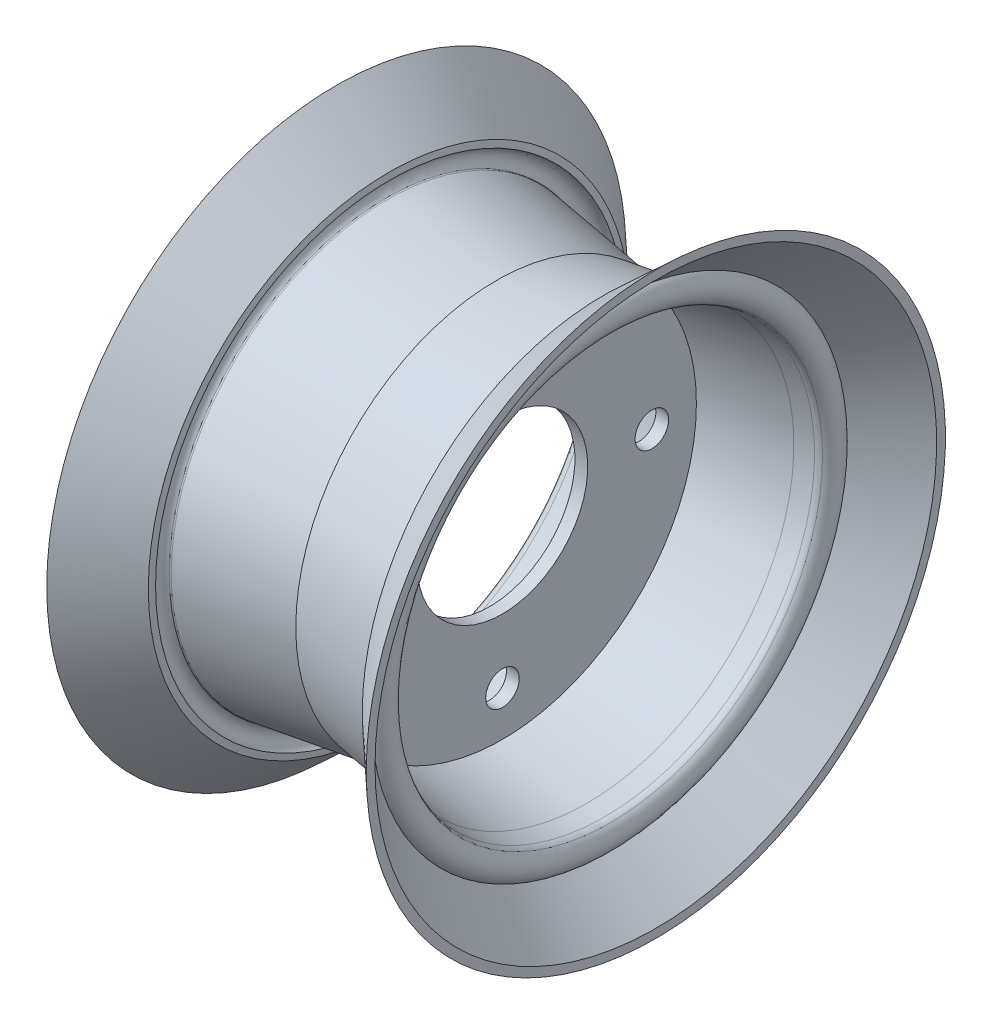
ISO-10303-21;
HEADER;
FILE_DESCRIPTION(('STEP AP214'),'2;1');
FILE_NAME('part.step','',(''),(''),'','','');
FILE_SCHEMA(('AUTOMOTIVE_DESIGN { 1 0 10303 214 1 1 1 1 }'));
ENDSEC;
DATA;
#1=APPLICATION_CONTEXT('core data for automotive mechanical design processes');
#2=APPLICATION_PROTOCOL_DEFINITION('international standard','automotive_design',2000,#1);
#3=PRODUCT_CONTEXT('',#1,'mechanical');
#4=PRODUCT('Part','Part','',(#3));
#5=PRODUCT_RELATED_PRODUCT_CATEGORY('part','',(#4));
#6=PRODUCT_DEFINITION_FORMATION('','',#4);
#7=PRODUCT_DEFINITION_CONTEXT('part definition',#1,'design');
#8=PRODUCT_DEFINITION('design','',#6,#7);
#9=PRODUCT_DEFINITION_SHAPE('','',#8);
#10=(LENGTH_UNIT() NAMED_UNIT(*) SI_UNIT(.MILLI.,.METRE.));
#11=(NAMED_UNIT(*) PLANE_ANGLE_UNIT() SI_UNIT($,.RADIAN.));
#12=(NAMED_UNIT(*) SI_UNIT($,.STERADIAN.) SOLID_ANGLE_UNIT());
#13=UNCERTAINTY_MEASURE_WITH_UNIT(LENGTH_MEASURE(1.E-05),#10,'distance_accuracy_value','');
#14=(GEOMETRIC_REPRESENTATION_CONTEXT(3) GLOBAL_UNCERTAINTY_ASSIGNED_CONTEXT((#13)) GLOBAL_UNIT_ASSIGNED_CONTEXT((#10,
#11,#12)) REPRESENTATION_CONTEXT('',''));
#15=CARTESIAN_POINT('',(0.,0.,0.));
#16=DIRECTION('',(0.,0.,1.));
#17=DIRECTION('',(1.,0.,0.));
#18=AXIS2_PLACEMENT_3D('',#15,#16,#17);
#19=CARTESIAN_POINT('',(1.50000000000001,45.4999999999999,0.));
#20=DIRECTION('',(-1.,0.,0.));
#21=DIRECTION('',(0.,0.,1.));
#22=AXIS2_PLACEMENT_3D('',#19,#20,#21);
#23=PLANE('',#22);
#24=CARTESIAN_POINT('',(1.50000000000001,-35.052,-1.9838902539883E-12));
#25=DIRECTION('',(-1.,0.,0.));
#26=DIRECTION('',(0.,0.,1.));
#27=AXIS2_PLACEMENT_3D('',#24,#25,#26);
#28=CIRCLE('',#27,3.93700000000213);
#29=CARTESIAN_POINT('',(1.50000000000001,-35.052,3.93700000000015));
#30=VERTEX_POINT('',#29);
#31=EDGE_CURVE('E84',#30,#30,#28,.T.);
#32=ORIENTED_EDGE('',*,*,#31,.T.);
#33=EDGE_LOOP('',(#32));
#34=FACE_BOUND('',#33,.T.);
#35=CARTESIAN_POINT('',(1.50000000000001,35.052,0.));
#36=DIRECTION('',(-1.,0.,0.));
#37=DIRECTION('',(0.,0.,1.));
#38=AXIS2_PLACEMENT_3D('',#35,#36,#37);
#39=CIRCLE('',#38,3.937);
#40=CARTESIAN_POINT('',(1.50000000000001,35.052,3.937));
#41=VERTEX_POINT('',#40);
#42=EDGE_CURVE('E78',#41,#41,#39,.T.);
#43=ORIENTED_EDGE('',*,*,#42,.T.);
#44=EDGE_LOOP('',(#43));
#45=FACE_BOUND('',#44,.T.);
#46=CARTESIAN_POINT('',(1.5,0.,0.));
#47=DIRECTION('',(-1.,0.,0.));
#48=DIRECTION('',(0.,0.,1.));
#49=AXIS2_PLACEMENT_3D('',#46,#47,#48);
#50=CIRCLE('',#49,45.4999999999999);
#51=CARTESIAN_POINT('',(1.5,0.,45.4999999999999));
#52=VERTEX_POINT('',#51);
#53=EDGE_CURVE('E75',#52,#52,#50,.T.);
#54=ORIENTED_EDGE('',*,*,#53,.F.);
#55=EDGE_LOOP('',(#54));
#56=FACE_BOUND('',#55,.T.);
#57=CARTESIAN_POINT('',(1.5,0.,0.));
#58=DIRECTION('',(-1.,0.,0.));
#59=DIRECTION('',(0.,0.,1.));
#60=AXIS2_PLACEMENT_3D('',#57,#58,#59);
#61=CIRCLE('',#60,20.000000000002);
#62=CARTESIAN_POINT('',(1.5,0.,20.000000000002));
#63=VERTEX_POINT('',#62);
#64=EDGE_CURVE('E10',#63,#63,#61,.T.);
#65=ORIENTED_EDGE('',*,*,#64,.T.);
#66=EDGE_LOOP('',(#65));
#67=FACE_BOUND('',#66,.T.);
#68=CARTESIAN_POINT('',(1.50000000000001,9.9194512699415E-13,-35.052000000001));
#69=DIRECTION('',(-1.,0.,0.));
#70=DIRECTION('',(0.,0.,1.));
#71=AXIS2_PLACEMENT_3D('',#68,#69,#70);
#72=CIRCLE('',#71,3.93700000000077);
#73=CARTESIAN_POINT('',(1.50000000000001,9.9194512699415E-13,-31.1150000000002));
#74=VERTEX_POINT('',#73);
#75=EDGE_CURVE('E81',#74,#74,#72,.T.);
#76=ORIENTED_EDGE('',*,*,#75,.T.);
#77=EDGE_LOOP('',(#76));
#78=FACE_BOUND('',#77,.T.);
#79=CARTESIAN_POINT('',(1.50000000000001,-9.96237758954521E-13,35.051999999999));
#80=DIRECTION('',(-1.,0.,0.));
#81=DIRECTION('',(0.,0.,1.));
#82=AXIS2_PLACEMENT_3D('',#79,#80,#81);
#83=CIRCLE('',#82,3.93700000000159);
#84=CARTESIAN_POINT('',(1.50000000000001,-9.96237758954521E-13,38.9890000000006));
#85=VERTEX_POINT('',#84);
#86=EDGE_CURVE('E87',#85,#85,#83,.T.);
#87=ORIENTED_EDGE('',*,*,#86,.T.);
#88=EDGE_LOOP('',(#87));
#89=FACE_BOUND('',#88,.T.);
#90=ADVANCED_FACE('F32',(#34,#45,#56,#67,#78,#89),#23,.F.);
#91=CARTESIAN_POINT('',(-124.142501928388,0.,0.));
#92=DIRECTION('',(-1.,0.,0.));
#93=DIRECTION('',(0.,0.,1.));
#94=AXIS2_PLACEMENT_3D('',#91,#92,#93);
#95=CYLINDRICAL_SURFACE('',#94,20.000000000002);
#96=ORIENTED_EDGE('',*,*,#64,.F.);
#97=EDGE_LOOP('',(#96));
#98=FACE_BOUND('',#97,.T.);
#99=CARTESIAN_POINT('',(-1.5,0.,0.));
#100=DIRECTION('',(-1.,0.,0.));
#101=DIRECTION('',(0.,0.,1.));
#102=AXIS2_PLACEMENT_3D('',#99,#100,#101);
#103=CIRCLE('',#102,20.000000000002);
#104=CARTESIAN_POINT('',(-1.5,0.,20.000000000002));
#105=VERTEX_POINT('',#104);
#106=EDGE_CURVE('E90',#105,#105,#103,.T.);
#107=ORIENTED_EDGE('',*,*,#106,.T.);
#108=EDGE_LOOP('',(#107));
#109=FACE_BOUND('',#108,.T.);
#110=ADVANCED_FACE('F156',(#98,#109),#95,.F.);
#111=CARTESIAN_POINT('',(25.4724020470986,0.,0.));
#112=DIRECTION('',(1.,0.,0.));
#113=DIRECTION('',(0.,0.,-1.));
#114=AXIS2_PLACEMENT_3D('',#111,#112,#113);
#115=CONICAL_SURFACE('',#114,50.7500000000004,0.146168211535246);
#116=CARTESIAN_POINT('',(-2.08166817117217E-13,0.,0.));
#117=DIRECTION('',(-1.,0.,0.));
#118=DIRECTION('',(0.,0.,1.));
#119=AXIS2_PLACEMENT_3D('',#116,#117,#118);
#120=CIRCLE('',#119,47.000000000001);
#121=CARTESIAN_POINT('',(-2.08166817117217E-13,0.,47.000000000001));
#122=VERTEX_POINT('',#121);
#123=EDGE_CURVE('E38',#122,#122,#120,.T.);
#124=ORIENTED_EDGE('',*,*,#123,.F.);
#125=EDGE_LOOP('',(#124));
#126=FACE_BOUND('',#125,.T.);
#127=CARTESIAN_POINT('',(25.4724020470986,0.,0.));
#128=DIRECTION('',(-1.,0.,0.));
#129=DIRECTION('',(0.,0.,1.));
#130=AXIS2_PLACEMENT_3D('',#127,#128,#129);
#131=CIRCLE('',#130,50.7500000000004);
#132=CARTESIAN_POINT('',(25.4724020470986,0.,50.7500000000004));
#133=VERTEX_POINT('',#132);
#134=EDGE_CURVE('E42',#133,#133,#131,.T.);
#135=ORIENTED_EDGE('',*,*,#134,.T.);
#136=EDGE_LOOP('',(#135));
#137=FACE_BOUND('',#136,.T.);
#138=ADVANCED_FACE('F158',(#126,#137),#115,.T.);
#139=CARTESIAN_POINT('',(25.4724020470988,0.,0.));
#140=DIRECTION('',(-1.,0.,0.));
#141=DIRECTION('',(0.,0.,1.));
#142=AXIS2_PLACEMENT_3D('',#139,#140,#141);
#143=TOROIDAL_SURFACE('',#142,51.25,0.499999999999622);
#144=ORIENTED_EDGE('',*,*,#134,.F.);
#145=EDGE_LOOP('',(#144));
#146=FACE_BOUND('',#145,.T.);
#147=CARTESIAN_POINT('',(25.8103133663892,0.,0.));
#148=DIRECTION('',(-1.,0.,0.));
#149=DIRECTION('',(0.,0.,1.));
#150=AXIS2_PLACEMENT_3D('',#147,#148,#149);
#151=CIRCLE('',#150,50.8814678571753);
#152=CARTESIAN_POINT('',(25.8103133663892,0.,50.8814678571753));
#153=VERTEX_POINT('',#152);
#154=EDGE_CURVE('E46',#153,#153,#151,.T.);
#155=ORIENTED_EDGE('',*,*,#154,.T.);
#156=EDGE_LOOP('',(#155));
#157=FACE_BOUND('',#156,.T.);
#158=ADVANCED_FACE('F164',(#146,#157),#143,.F.);
#159=CARTESIAN_POINT('',(24.1640290544823,0.,0.));
#160=DIRECTION('',(-1.,0.,0.));
#161=DIRECTION('',(0.,0.,1.));
#162=AXIS2_PLACEMENT_3D('',#159,#160,#161);
#163=TOROIDAL_SURFACE('',#162,52.6769350419976,2.43597094551729);
#164=ORIENTED_EDGE('',*,*,#154,.F.);
#165=EDGE_LOOP('',(#164));
#166=FACE_BOUND('',#165,.T.);
#167=CARTESIAN_POINT('',(24.897052688691,0.,0.));
#168=DIRECTION('',(-1.,0.,0.));
#169=DIRECTION('',(0.,0.,1.));
#170=AXIS2_PLACEMENT_3D('',#167,#168,#169);
#171=CIRCLE('',#170,54.9999999999994);
#172=CARTESIAN_POINT('',(24.897052688691,0.,54.9999999999994));
#173=VERTEX_POINT('',#172);
#174=EDGE_CURVE('E51',#173,#173,#171,.T.);
#175=ORIENTED_EDGE('',*,*,#174,.T.);
#176=EDGE_LOOP('',(#175));
#177=FACE_BOUND('',#176,.T.);
#178=ADVANCED_FACE('F171',(#166,#177),#163,.F.);
#179=CARTESIAN_POINT('',(25.1000000000006,0.,0.));
#180=DIRECTION('',(1.,0.,0.));
#181=DIRECTION('',(0.,0.,-1.));
#182=AXIS2_PLACEMENT_3D('',#179,#180,#181);
#183=CONICAL_SURFACE('',#182,56.4999999999994,1.43631474044547);
#184=ORIENTED_EDGE('',*,*,#174,.F.);
#185=EDGE_LOOP('',(#184));
#186=FACE_BOUND('',#185,.T.);
#187=CARTESIAN_POINT('',(25.1000000000006,0.,0.));
#188=DIRECTION('',(-1.,0.,0.));
#189=DIRECTION('',(0.,0.,1.));
#190=AXIS2_PLACEMENT_3D('',#187,#188,#189);
#191=CIRCLE('',#190,56.4999999999994);
#192=CARTESIAN_POINT('',(25.1000000000006,0.,56.4999999999994));
#193=VERTEX_POINT('',#192);
#194=EDGE_CURVE('E54',#193,#193,#191,.T.);
#195=ORIENTED_EDGE('',*,*,#194,.T.);
#196=EDGE_LOOP('',(#195));
#197=FACE_BOUND('',#196,.T.);
#198=ADVANCED_FACE('F175',(#186,#197),#183,.T.);
#199=CARTESIAN_POINT('',(37.4843362016493,0.,0.));
#200=DIRECTION('',(1.,0.,0.));
#201=DIRECTION('',(0.,0.,-1.));
#202=AXIS2_PLACEMENT_3D('',#199,#200,#201);
#203=CONICAL_SURFACE('',#202,67.9497235818508,0.746204923834872);
#204=ORIENTED_EDGE('',*,*,#194,.F.);
#205=EDGE_LOOP('',(#204));
#206=FACE_BOUND('',#205,.T.);
#207=CARTESIAN_POINT('',(37.4843362016493,0.,0.));
#208=DIRECTION('',(-1.,0.,0.));
#209=DIRECTION('',(0.,0.,1.));
#210=AXIS2_PLACEMENT_3D('',#207,#208,#209);
#211=CIRCLE('',#210,67.9497235818508);
#212=CARTESIAN_POINT('',(37.4843362016493,0.,67.9497235818508));
#213=VERTEX_POINT('',#212);
#214=EDGE_CURVE('E57',#213,#213,#211,.T.);
#215=ORIENTED_EDGE('',*,*,#214,.T.);
#216=EDGE_LOOP('',(#215));
#217=FACE_BOUND('',#216,.T.);
#218=ADVANCED_FACE('F179',(#206,#217),#203,.T.);
#219=CARTESIAN_POINT('',(37.4843362016493,67.9497235818508,0.));
#220=DIRECTION('',(-1.,0.,0.));
#221=DIRECTION('',(0.,0.,1.));
#222=AXIS2_PLACEMENT_3D('',#219,#220,#221);
#223=PLANE('',#222);
#224=ORIENTED_EDGE('',*,*,#214,.F.);
#225=EDGE_LOOP('',(#224));
#226=FACE_BOUND('',#225,.T.);
#227=CARTESIAN_POINT('',(37.4843362016493,0.,0.));
#228=DIRECTION('',(-1.,0.,0.));
#229=DIRECTION('',(0.,0.,1.));
#230=AXIS2_PLACEMENT_3D('',#227,#228,#229);
#231=CIRCLE('',#230,65.8917488127233);
#232=CARTESIAN_POINT('',(37.4843362016493,0.,65.8917488127233));
#233=VERTEX_POINT('',#232);
#234=EDGE_CURVE('E60',#233,#233,#231,.T.);
#235=ORIENTED_EDGE('',*,*,#234,.T.);
#236=EDGE_LOOP('',(#235));
#237=FACE_BOUND('',#236,.T.);
#238=ADVANCED_FACE('F183',(#226,#237),#223,.F.);
#239=CARTESIAN_POINT('',(26.5381016804968,0.,0.));
#240=DIRECTION('',(1.,0.,0.));
#241=DIRECTION('',(0.,0.,-1.));
#242=AXIS2_PLACEMENT_3D('',#239,#240,#241);
#243=CONICAL_SURFACE('',#242,55.8163054327556,0.743998347813694);
#244=ORIENTED_EDGE('',*,*,#234,.F.);
#245=EDGE_LOOP('',(#244));
#246=FACE_BOUND('',#245,.T.);
#247=CARTESIAN_POINT('',(26.5381016804968,0.,0.));
#248=DIRECTION('',(-1.,0.,0.));
#249=DIRECTION('',(0.,0.,1.));
#250=AXIS2_PLACEMENT_3D('',#247,#248,#249);
#251=CIRCLE('',#250,55.8163054327556);
#252=CARTESIAN_POINT('',(26.5381016804968,0.,55.8163054327556));
#253=VERTEX_POINT('',#252);
#254=EDGE_CURVE('E63',#253,#253,#251,.T.);
#255=ORIENTED_EDGE('',*,*,#254,.T.);
#256=EDGE_LOOP('',(#255));
#257=FACE_BOUND('',#256,.T.);
#258=ADVANCED_FACE('F187',(#246,#257),#243,.F.);
#259=CARTESIAN_POINT('',(24.1640290544823,0.,0.));
#260=DIRECTION('',(-1.,0.,0.));
#261=DIRECTION('',(0.,0.,1.));
#262=AXIS2_PLACEMENT_3D('',#259,#260,#261);
#263=TOROIDAL_SURFACE('',#262,52.6769350419976,3.9359709455177);
#264=ORIENTED_EDGE('',*,*,#254,.F.);
#265=EDGE_LOOP('',(#264));
#266=FACE_BOUND('',#265,.T.);
#267=CARTESIAN_POINT('',(26.8240473242613,0.,0.));
#268=DIRECTION('',(-1.,0.,0.));
#269=DIRECTION('',(0.,0.,1.));
#270=AXIS2_PLACEMENT_3D('',#267,#268,#269);
#271=CIRCLE('',#270,49.7758714286996);
#272=CARTESIAN_POINT('',(26.8240473242613,0.,49.7758714286996));
#273=VERTEX_POINT('',#272);
#274=EDGE_CURVE('E66',#273,#273,#271,.T.);
#275=ORIENTED_EDGE('',*,*,#274,.T.);
#276=EDGE_LOOP('',(#275));
#277=FACE_BOUND('',#276,.T.);
#278=ADVANCED_FACE('F191',(#266,#277),#263,.T.);
#279=CARTESIAN_POINT('',(25.4724020470988,0.,0.));
#280=DIRECTION('',(-1.,0.,0.));
#281=DIRECTION('',(0.,0.,1.));
#282=AXIS2_PLACEMENT_3D('',#279,#280,#281);
#283=TOROIDAL_SURFACE('',#282,51.25,2.);
#284=ORIENTED_EDGE('',*,*,#274,.F.);
#285=EDGE_LOOP('',(#284));
#286=FACE_BOUND('',#285,.T.);
#287=CARTESIAN_POINT('',(25.4724020470987,0.,0.));
#288=DIRECTION('',(-1.,0.,0.));
#289=DIRECTION('',(0.,0.,1.));
#290=AXIS2_PLACEMENT_3D('',#287,#288,#289);
#291=CIRCLE('',#290,49.25);
#292=CARTESIAN_POINT('',(25.4724020470987,0.,49.25));
#293=VERTEX_POINT('',#292);
#294=EDGE_CURVE('E69',#293,#293,#291,.T.);
#295=ORIENTED_EDGE('',*,*,#294,.T.);
#296=EDGE_LOOP('',(#295));
#297=FACE_BOUND('',#296,.T.);
#298=ADVANCED_FACE('F195',(#286,#297),#283,.T.);
#299=CARTESIAN_POINT('',(21.2997642480137,0.,0.));
#300=DIRECTION('',(1.,0.,0.));
#301=DIRECTION('',(0.,0.,-1.));
#302=AXIS2_PLACEMENT_3D('',#299,#300,#301);
#303=CONICAL_SURFACE('',#302,48.5774408530383,0.159808722866517);
#304=ORIENTED_EDGE('',*,*,#294,.F.);
#305=EDGE_LOOP('',(#304));
#306=FACE_BOUND('',#305,.T.);
#307=CARTESIAN_POINT('',(21.2997642480137,0.,0.));
#308=DIRECTION('',(-1.,0.,0.));
#309=DIRECTION('',(0.,0.,1.));
#310=AXIS2_PLACEMENT_3D('',#307,#308,#309);
#311=CIRCLE('',#310,48.5774408530383);
#312=CARTESIAN_POINT('',(21.2997642480137,0.,48.5774408530383));
#313=VERTEX_POINT('',#312);
#314=EDGE_CURVE('E72',#313,#313,#311,.T.);
#315=ORIENTED_EDGE('',*,*,#314,.T.);
#316=EDGE_LOOP('',(#315));
#317=FACE_BOUND('',#316,.T.);
#318=ADVANCED_FACE('F199',(#306,#317),#303,.F.);
#319=CARTESIAN_POINT('',(1.5,0.,0.));
#320=DIRECTION('',(1.,0.,0.));
#321=DIRECTION('',(0.,0.,-1.));
#322=AXIS2_PLACEMENT_3D('',#319,#320,#321);
#323=CONICAL_SURFACE('',#322,45.4999999999999,0.154194384218403);
#324=ORIENTED_EDGE('',*,*,#314,.F.);
#325=EDGE_LOOP('',(#324));
#326=FACE_BOUND('',#325,.T.);
#327=ORIENTED_EDGE('',*,*,#53,.T.);
#328=EDGE_LOOP('',(#327));
#329=FACE_BOUND('',#328,.T.);
#330=ADVANCED_FACE('F203',(#326,#329),#323,.F.);
#331=CARTESIAN_POINT('',(12.6355175901318,35.052,0.));
#332=DIRECTION('',(-1.,0.,0.));
#333=DIRECTION('',(0.,0.,1.));
#334=AXIS2_PLACEMENT_3D('',#331,#332,#333);
#335=CYLINDRICAL_SURFACE('',#334,3.937);
#336=ORIENTED_EDGE('',*,*,#42,.F.);
#337=EDGE_LOOP('',(#336));
#338=FACE_BOUND('',#337,.T.);
#339=CARTESIAN_POINT('',(-1.50000000000001,35.052,0.));
#340=DIRECTION('',(1.,0.,0.));
#341=DIRECTION('',(0.,0.,-1.));
#342=AXIS2_PLACEMENT_3D('',#339,#340,#341);
#343=CIRCLE('',#342,3.937);
#344=CARTESIAN_POINT('',(-1.50000000000001,35.052,-3.937));
#345=VERTEX_POINT('',#344);
#346=EDGE_CURVE('E126',#345,#345,#343,.F.);
#347=ORIENTED_EDGE('',*,*,#346,.T.);
#348=EDGE_LOOP('',(#347));
#349=FACE_BOUND('',#348,.T.);
#350=ADVANCED_FACE('F207',(#338,#349),#335,.F.);
#351=CARTESIAN_POINT('',(12.6355175901318,9.9194512699415E-13,-35.052000000001));
#352=DIRECTION('',(-1.,0.,0.));
#353=DIRECTION('',(0.,0.,1.));
#354=AXIS2_PLACEMENT_3D('',#351,#352,#353);
#355=CYLINDRICAL_SURFACE('',#354,3.93700000000077);
#356=ORIENTED_EDGE('',*,*,#75,.F.);
#357=EDGE_LOOP('',(#356));
#358=FACE_BOUND('',#357,.T.);
#359=CARTESIAN_POINT('',(-1.50000000000001,9.9194512699415E-13,-35.052000000001));
#360=DIRECTION('',(1.,0.,0.));
#361=DIRECTION('',(0.,0.,-1.));
#362=AXIS2_PLACEMENT_3D('',#359,#360,#361);
#363=CIRCLE('',#362,3.93700000000077);
#364=CARTESIAN_POINT('',(-1.50000000000001,9.9194512699415E-13,-38.9890000000018));
#365=VERTEX_POINT('',#364);
#366=EDGE_CURVE('E129',#365,#365,#363,.F.);
#367=ORIENTED_EDGE('',*,*,#366,.T.);
#368=EDGE_LOOP('',(#367));
#369=FACE_BOUND('',#368,.T.);
#370=ADVANCED_FACE('F211',(#358,#369),#355,.F.);
#371=CARTESIAN_POINT('',(12.6355175901318,-35.052,-1.9838902539883E-12));
#372=DIRECTION('',(-1.,0.,0.));
#373=DIRECTION('',(0.,0.,1.));
#374=AXIS2_PLACEMENT_3D('',#371,#372,#373);
#375=CYLINDRICAL_SURFACE('',#374,3.93700000000213);
#376=ORIENTED_EDGE('',*,*,#31,.F.);
#377=EDGE_LOOP('',(#376));
#378=FACE_BOUND('',#377,.T.);
#379=CARTESIAN_POINT('',(-1.50000000000001,-35.052,-1.9838902539883E-12));
#380=DIRECTION('',(1.,0.,0.));
#381=DIRECTION('',(0.,0.,-1.));
#382=AXIS2_PLACEMENT_3D('',#379,#380,#381);
#383=CIRCLE('',#382,3.93700000000213);
#384=CARTESIAN_POINT('',(-1.50000000000001,-35.052,-3.93700000000411));
#385=VERTEX_POINT('',#384);
#386=EDGE_CURVE('E132',#385,#385,#383,.F.);
#387=ORIENTED_EDGE('',*,*,#386,.T.);
#388=EDGE_LOOP('',(#387));
#389=FACE_BOUND('',#388,.T.);
#390=ADVANCED_FACE('F215',(#378,#389),#375,.F.);
#391=CARTESIAN_POINT('',(12.6355175901318,-9.96237758954521E-13,35.051999999999));
#392=DIRECTION('',(-1.,0.,0.));
#393=DIRECTION('',(0.,0.,1.));
#394=AXIS2_PLACEMENT_3D('',#391,#392,#393);
#395=CYLINDRICAL_SURFACE('',#394,3.93700000000159);
#396=ORIENTED_EDGE('',*,*,#86,.F.);
#397=EDGE_LOOP('',(#396));
#398=FACE_BOUND('',#397,.T.);
#399=CARTESIAN_POINT('',(-1.50000000000001,-9.96237758954521E-13,35.051999999999));
#400=DIRECTION('',(1.,0.,0.));
#401=DIRECTION('',(0.,0.,-1.));
#402=AXIS2_PLACEMENT_3D('',#399,#400,#401);
#403=CIRCLE('',#402,3.93700000000159);
#404=CARTESIAN_POINT('',(-1.50000000000001,-9.96237758954521E-13,31.1149999999974));
#405=VERTEX_POINT('',#404);
#406=EDGE_CURVE('E135',#405,#405,#403,.F.);
#407=ORIENTED_EDGE('',*,*,#406,.T.);
#408=EDGE_LOOP('',(#407));
#409=FACE_BOUND('',#408,.T.);
#410=ADVANCED_FACE('F139',(#398,#409),#395,.F.);
#411=CARTESIAN_POINT('',(-1.50000000000001,45.4999999999999,0.));
#412=DIRECTION('',(1.,0.,0.));
#413=DIRECTION('',(0.,0.,1.));
#414=AXIS2_PLACEMENT_3D('',#411,#412,#413);
#415=PLANE('',#414);
#416=ORIENTED_EDGE('',*,*,#406,.F.);
#417=EDGE_LOOP('',(#416));
#418=FACE_BOUND('',#417,.T.);
#419=ORIENTED_EDGE('',*,*,#386,.F.);
#420=EDGE_LOOP('',(#419));
#421=FACE_BOUND('',#420,.T.);
#422=ORIENTED_EDGE('',*,*,#366,.F.);
#423=EDGE_LOOP('',(#422));
#424=FACE_BOUND('',#423,.T.);
#425=ORIENTED_EDGE('',*,*,#346,.F.);
#426=EDGE_LOOP('',(#425));
#427=FACE_BOUND('',#426,.T.);
#428=CARTESIAN_POINT('',(-1.5,0.,0.));
#429=DIRECTION('',(-1.,0.,0.));
#430=DIRECTION('',(0.,0.,1.));
#431=AXIS2_PLACEMENT_3D('',#428,#429,#430);
#432=CIRCLE('',#431,45.4999999999999);
#433=CARTESIAN_POINT('',(-1.5,0.,45.4999999999999));
#434=VERTEX_POINT('',#433);
#435=EDGE_CURVE('E123',#434,#434,#432,.T.);
#436=ORIENTED_EDGE('',*,*,#435,.T.);
#437=EDGE_LOOP('',(#436));
#438=FACE_BOUND('',#437,.T.);
#439=ORIENTED_EDGE('',*,*,#106,.F.);
#440=EDGE_LOOP('',(#439));
#441=FACE_BOUND('',#440,.T.);
#442=ADVANCED_FACE('F141',(#418,#421,#424,#427,#438,#441),#415,.F.);
#443=CARTESIAN_POINT('',(-25.4724020470986,0.,0.));
#444=DIRECTION('',(-1.,0.,0.));
#445=DIRECTION('',(0.,0.,-1.));
#446=AXIS2_PLACEMENT_3D('',#443,#444,#445);
#447=CONICAL_SURFACE('',#446,50.7500000000004,0.146168211535246);
#448=ORIENTED_EDGE('',*,*,#123,.T.);
#449=EDGE_LOOP('',(#448));
#450=FACE_BOUND('',#449,.T.);
#451=CARTESIAN_POINT('',(-25.4724020470986,0.,0.));
#452=DIRECTION('',(-1.,0.,0.));
#453=DIRECTION('',(0.,0.,1.));
#454=AXIS2_PLACEMENT_3D('',#451,#452,#453);
#455=CIRCLE('',#454,50.7500000000004);
#456=CARTESIAN_POINT('',(-25.4724020470986,0.,50.7500000000004));
#457=VERTEX_POINT('',#456);
#458=EDGE_CURVE('E93',#457,#457,#455,.T.);
#459=ORIENTED_EDGE('',*,*,#458,.F.);
#460=EDGE_LOOP('',(#459));
#461=FACE_BOUND('',#460,.T.);
#462=ADVANCED_FACE('F144',(#450,#461),#447,.T.);
#463=CARTESIAN_POINT('',(-25.4724020470988,0.,0.));
#464=DIRECTION('',(1.,0.,0.));
#465=DIRECTION('',(0.,0.,1.));
#466=AXIS2_PLACEMENT_3D('',#463,#464,#465);
#467=TOROIDAL_SURFACE('',#466,51.25,0.499999999999622);
#468=ORIENTED_EDGE('',*,*,#458,.T.);
#469=EDGE_LOOP('',(#468));
#470=FACE_BOUND('',#469,.T.);
#471=CARTESIAN_POINT('',(-25.8103133663892,0.,0.));
#472=DIRECTION('',(-1.,0.,0.));
#473=DIRECTION('',(0.,0.,1.));
#474=AXIS2_PLACEMENT_3D('',#471,#472,#473);
#475=CIRCLE('',#474,50.8814678571753);
#476=CARTESIAN_POINT('',(-25.8103133663892,0.,50.8814678571753));
#477=VERTEX_POINT('',#476);
#478=EDGE_CURVE('E96',#477,#477,#475,.T.);
#479=ORIENTED_EDGE('',*,*,#478,.F.);
#480=EDGE_LOOP('',(#479));
#481=FACE_BOUND('',#480,.T.);
#482=ADVANCED_FACE('F225',(#470,#481),#467,.F.);
#483=CARTESIAN_POINT('',(-24.1640290544823,0.,0.));
#484=DIRECTION('',(1.,0.,0.));
#485=DIRECTION('',(0.,0.,1.));
#486=AXIS2_PLACEMENT_3D('',#483,#484,#485);
#487=TOROIDAL_SURFACE('',#486,52.6769350419976,2.43597094551729);
#488=ORIENTED_EDGE('',*,*,#478,.T.);
#489=EDGE_LOOP('',(#488));
#490=FACE_BOUND('',#489,.T.);
#491=CARTESIAN_POINT('',(-24.897052688691,0.,0.));
#492=DIRECTION('',(-1.,0.,0.));
#493=DIRECTION('',(0.,0.,1.));
#494=AXIS2_PLACEMENT_3D('',#491,#492,#493);
#495=CIRCLE('',#494,54.9999999999994);
#496=CARTESIAN_POINT('',(-24.897052688691,0.,54.9999999999994));
#497=VERTEX_POINT('',#496);
#498=EDGE_CURVE('E99',#497,#497,#495,.T.);
#499=ORIENTED_EDGE('',*,*,#498,.F.);
#500=EDGE_LOOP('',(#499));
#501=FACE_BOUND('',#500,.T.);
#502=ADVANCED_FACE('F228',(#490,#501),#487,.F.);
#503=CARTESIAN_POINT('',(-25.1000000000006,0.,0.));
#504=DIRECTION('',(-1.,0.,0.));
#505=DIRECTION('',(0.,0.,-1.));
#506=AXIS2_PLACEMENT_3D('',#503,#504,#505);
#507=CONICAL_SURFACE('',#506,56.4999999999994,1.43631474044547);
#508=ORIENTED_EDGE('',*,*,#498,.T.);
#509=EDGE_LOOP('',(#508));
#510=FACE_BOUND('',#509,.T.);
#511=CARTESIAN_POINT('',(-25.1000000000006,0.,0.));
#512=DIRECTION('',(-1.,0.,0.));
#513=DIRECTION('',(0.,0.,1.));
#514=AXIS2_PLACEMENT_3D('',#511,#512,#513);
#515=CIRCLE('',#514,56.4999999999994);
#516=CARTESIAN_POINT('',(-25.1000000000006,0.,56.4999999999994));
#517=VERTEX_POINT('',#516);
#518=EDGE_CURVE('E102',#517,#517,#515,.T.);
#519=ORIENTED_EDGE('',*,*,#518,.F.);
#520=EDGE_LOOP('',(#519));
#521=FACE_BOUND('',#520,.T.);
#522=ADVANCED_FACE('F232',(#510,#521),#507,.T.);
#523=CARTESIAN_POINT('',(-37.4843362016493,0.,0.));
#524=DIRECTION('',(-1.,0.,0.));
#525=DIRECTION('',(0.,0.,-1.));
#526=AXIS2_PLACEMENT_3D('',#523,#524,#525);
#527=CONICAL_SURFACE('',#526,67.9497235818508,0.746204923834872);
#528=ORIENTED_EDGE('',*,*,#518,.T.);
#529=EDGE_LOOP('',(#528));
#530=FACE_BOUND('',#529,.T.);
#531=CARTESIAN_POINT('',(-37.4843362016493,0.,0.));
#532=DIRECTION('',(-1.,0.,0.));
#533=DIRECTION('',(0.,0.,1.));
#534=AXIS2_PLACEMENT_3D('',#531,#532,#533);
#535=CIRCLE('',#534,67.9497235818508);
#536=CARTESIAN_POINT('',(-37.4843362016493,0.,67.9497235818508));
#537=VERTEX_POINT('',#536);
#538=EDGE_CURVE('E105',#537,#537,#535,.T.);
#539=ORIENTED_EDGE('',*,*,#538,.F.);
#540=EDGE_LOOP('',(#539));
#541=FACE_BOUND('',#540,.T.);
#542=ADVANCED_FACE('F236',(#530,#541),#527,.T.);
#543=CARTESIAN_POINT('',(-37.4843362016493,67.9497235818508,0.));
#544=DIRECTION('',(1.,0.,0.));
#545=DIRECTION('',(0.,0.,1.));
#546=AXIS2_PLACEMENT_3D('',#543,#544,#545);
#547=PLANE('',#546);
#548=ORIENTED_EDGE('',*,*,#538,.T.);
#549=EDGE_LOOP('',(#548));
#550=FACE_BOUND('',#549,.T.);
#551=CARTESIAN_POINT('',(-37.4843362016493,0.,0.));
#552=DIRECTION('',(-1.,0.,0.));
#553=DIRECTION('',(0.,0.,1.));
#554=AXIS2_PLACEMENT_3D('',#551,#552,#553);
#555=CIRCLE('',#554,65.8917488127233);
#556=CARTESIAN_POINT('',(-37.4843362016493,0.,65.8917488127233));
#557=VERTEX_POINT('',#556);
#558=EDGE_CURVE('E108',#557,#557,#555,.T.);
#559=ORIENTED_EDGE('',*,*,#558,.F.);
#560=EDGE_LOOP('',(#559));
#561=FACE_BOUND('',#560,.T.);
#562=ADVANCED_FACE('F240',(#550,#561),#547,.F.);
#563=CARTESIAN_POINT('',(-26.5381016804968,0.,0.));
#564=DIRECTION('',(-1.,0.,0.));
#565=DIRECTION('',(0.,0.,-1.));
#566=AXIS2_PLACEMENT_3D('',#563,#564,#565);
#567=CONICAL_SURFACE('',#566,55.8163054327556,0.743998347813694);
#568=ORIENTED_EDGE('',*,*,#558,.T.);
#569=EDGE_LOOP('',(#568));
#570=FACE_BOUND('',#569,.T.);
#571=CARTESIAN_POINT('',(-26.5381016804968,0.,0.));
#572=DIRECTION('',(-1.,0.,0.));
#573=DIRECTION('',(0.,0.,1.));
#574=AXIS2_PLACEMENT_3D('',#571,#572,#573);
#575=CIRCLE('',#574,55.8163054327556);
#576=CARTESIAN_POINT('',(-26.5381016804968,0.,55.8163054327556));
#577=VERTEX_POINT('',#576);
#578=EDGE_CURVE('E111',#577,#577,#575,.T.);
#579=ORIENTED_EDGE('',*,*,#578,.F.);
#580=EDGE_LOOP('',(#579));
#581=FACE_BOUND('',#580,.T.);
#582=ADVANCED_FACE('F244',(#570,#581),#567,.F.);
#583=CARTESIAN_POINT('',(-24.1640290544823,0.,0.));
#584=DIRECTION('',(1.,0.,0.));
#585=DIRECTION('',(0.,0.,1.));
#586=AXIS2_PLACEMENT_3D('',#583,#584,#585);
#587=TOROIDAL_SURFACE('',#586,52.6769350419976,3.9359709455177);
#588=ORIENTED_EDGE('',*,*,#578,.T.);
#589=EDGE_LOOP('',(#588));
#590=FACE_BOUND('',#589,.T.);
#591=CARTESIAN_POINT('',(-26.8240473242613,0.,0.));
#592=DIRECTION('',(-1.,0.,0.));
#593=DIRECTION('',(0.,0.,1.));
#594=AXIS2_PLACEMENT_3D('',#591,#592,#593);
#595=CIRCLE('',#594,49.7758714286996);
#596=CARTESIAN_POINT('',(-26.8240473242613,0.,49.7758714286996));
#597=VERTEX_POINT('',#596);
#598=EDGE_CURVE('E114',#597,#597,#595,.T.);
#599=ORIENTED_EDGE('',*,*,#598,.F.);
#600=EDGE_LOOP('',(#599));
#601=FACE_BOUND('',#600,.T.);
#602=ADVANCED_FACE('F248',(#590,#601),#587,.T.);
#603=CARTESIAN_POINT('',(-25.4724020470988,0.,0.));
#604=DIRECTION('',(1.,0.,0.));
#605=DIRECTION('',(0.,0.,1.));
#606=AXIS2_PLACEMENT_3D('',#603,#604,#605);
#607=TOROIDAL_SURFACE('',#606,51.25,2.);
#608=ORIENTED_EDGE('',*,*,#598,.T.);
#609=EDGE_LOOP('',(#608));
#610=FACE_BOUND('',#609,.T.);
#611=CARTESIAN_POINT('',(-25.4724020470987,0.,0.));
#612=DIRECTION('',(-1.,0.,0.));
#613=DIRECTION('',(0.,0.,1.));
#614=AXIS2_PLACEMENT_3D('',#611,#612,#613);
#615=CIRCLE('',#614,49.25);
#616=CARTESIAN_POINT('',(-25.4724020470987,0.,49.25));
#617=VERTEX_POINT('',#616);
#618=EDGE_CURVE('E117',#617,#617,#615,.T.);
#619=ORIENTED_EDGE('',*,*,#618,.F.);
#620=EDGE_LOOP('',(#619));
#621=FACE_BOUND('',#620,.T.);
#622=ADVANCED_FACE('F252',(#610,#621),#607,.T.);
#623=CARTESIAN_POINT('',(-21.2997642480137,0.,0.));
#624=DIRECTION('',(-1.,0.,0.));
#625=DIRECTION('',(0.,0.,-1.));
#626=AXIS2_PLACEMENT_3D('',#623,#624,#625);
#627=CONICAL_SURFACE('',#626,48.5774408530383,0.159808722866517);
#628=ORIENTED_EDGE('',*,*,#618,.T.);
#629=EDGE_LOOP('',(#628));
#630=FACE_BOUND('',#629,.T.);
#631=CARTESIAN_POINT('',(-21.2997642480137,0.,0.));
#632=DIRECTION('',(-1.,0.,0.));
#633=DIRECTION('',(0.,0.,1.));
#634=AXIS2_PLACEMENT_3D('',#631,#632,#633);
#635=CIRCLE('',#634,48.5774408530383);
#636=CARTESIAN_POINT('',(-21.2997642480137,0.,48.5774408530383));
#637=VERTEX_POINT('',#636);
#638=EDGE_CURVE('E120',#637,#637,#635,.T.);
#639=ORIENTED_EDGE('',*,*,#638,.F.);
#640=EDGE_LOOP('',(#639));
#641=FACE_BOUND('',#640,.T.);
#642=ADVANCED_FACE('F256',(#630,#641),#627,.F.);
#643=CARTESIAN_POINT('',(-1.5,0.,0.));
#644=DIRECTION('',(-1.,0.,0.));
#645=DIRECTION('',(0.,0.,-1.));
#646=AXIS2_PLACEMENT_3D('',#643,#644,#645);
#647=CONICAL_SURFACE('',#646,45.4999999999999,0.154194384218403);
#648=ORIENTED_EDGE('',*,*,#638,.T.);
#649=EDGE_LOOP('',(#648));
#650=FACE_BOUND('',#649,.T.);
#651=ORIENTED_EDGE('',*,*,#435,.F.);
#652=EDGE_LOOP('',(#651));
#653=FACE_BOUND('',#652,.T.);
#654=ADVANCED_FACE('F260',(#650,#653),#647,.F.);
#655=CLOSED_SHELL('',(#90,#110,#138,#158,#178,#198,#218,#238,#258,#278,#298,#318,#330,#350,#370,
#390,#410,#442,#462,#482,#502,#522,#542,#562,#582,#602,#622,#642,#654));
#656=MANIFOLD_SOLID_BREP('B2',#655);
#657=ADVANCED_BREP_SHAPE_REPRESENTATION('',(#18,#656),#14);
#658=SHAPE_DEFINITION_REPRESENTATION(#9,#657);
ENDSEC;
END-ISO-10303-21;
